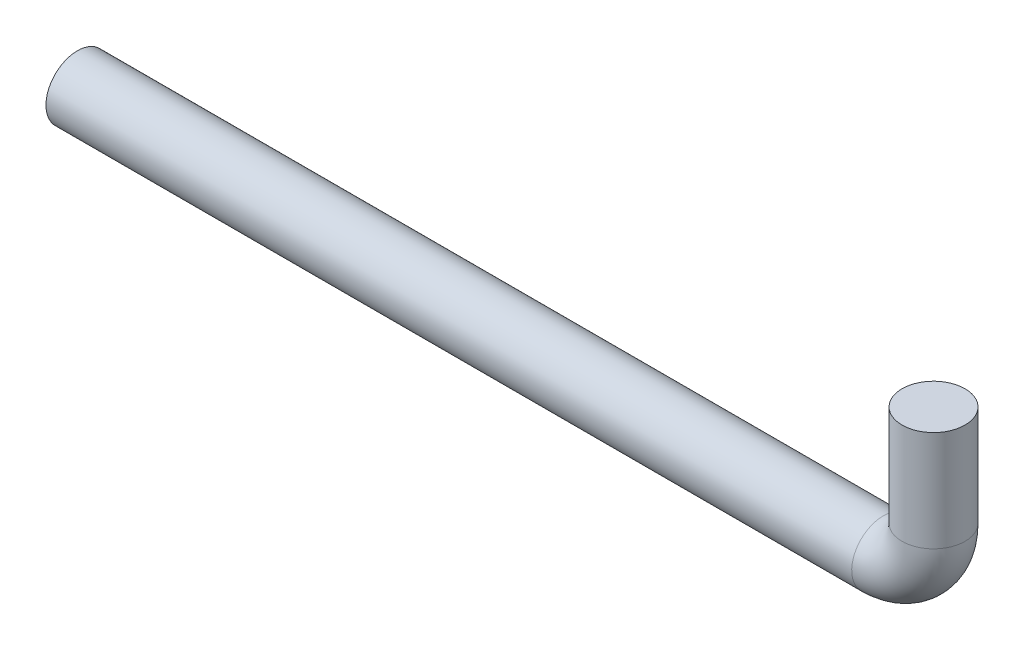
ISO-10303-21;
HEADER;
FILE_DESCRIPTION(('STEP AP214'),'2;1');
FILE_NAME('part.step','',(''),(''),'','','');
FILE_SCHEMA(('AUTOMOTIVE_DESIGN { 1 0 10303 214 1 1 1 1 }'));
ENDSEC;
DATA;
#1=APPLICATION_CONTEXT('core data for automotive mechanical design processes');
#2=APPLICATION_PROTOCOL_DEFINITION('international standard','automotive_design',2000,#1);
#3=PRODUCT_CONTEXT('',#1,'mechanical');
#4=PRODUCT('Part','Part','',(#3));
#5=PRODUCT_RELATED_PRODUCT_CATEGORY('part','',(#4));
#6=PRODUCT_DEFINITION_FORMATION('','',#4);
#7=PRODUCT_DEFINITION_CONTEXT('part definition',#1,'design');
#8=PRODUCT_DEFINITION('design','',#6,#7);
#9=PRODUCT_DEFINITION_SHAPE('','',#8);
#10=(LENGTH_UNIT() NAMED_UNIT(*) SI_UNIT(.MILLI.,.METRE.));
#11=(NAMED_UNIT(*) PLANE_ANGLE_UNIT() SI_UNIT($,.RADIAN.));
#12=(NAMED_UNIT(*) SI_UNIT($,.STERADIAN.) SOLID_ANGLE_UNIT());
#13=UNCERTAINTY_MEASURE_WITH_UNIT(LENGTH_MEASURE(1.E-05),#10,'distance_accuracy_value','');
#14=(GEOMETRIC_REPRESENTATION_CONTEXT(3) GLOBAL_UNCERTAINTY_ASSIGNED_CONTEXT((#13)) GLOBAL_UNIT_ASSIGNED_CONTEXT((#10,
#11,#12)) REPRESENTATION_CONTEXT('',''));
#15=CARTESIAN_POINT('',(0.,0.,0.));
#16=DIRECTION('',(0.,0.,1.));
#17=DIRECTION('',(1.,0.,0.));
#18=AXIS2_PLACEMENT_3D('',#15,#16,#17);
#19=CARTESIAN_POINT('',(0.,0.,0.));
#20=DIRECTION('',(1.,0.,0.));
#21=DIRECTION('',(0.,0.,-1.));
#22=AXIS2_PLACEMENT_3D('',#19,#20,#21);
#23=PLANE('',#22);
#24=CARTESIAN_POINT('',(0.,0.,0.));
#25=DIRECTION('',(1.,0.,0.));
#26=DIRECTION('',(0.,0.,-1.));
#27=AXIS2_PLACEMENT_3D('',#24,#25,#26);
#28=CIRCLE('',#27,0.79375);
#29=CARTESIAN_POINT('',(0.,0.,-0.79375));
#30=VERTEX_POINT('',#29);
#31=EDGE_CURVE('E49',#30,#30,#28,.T.);
#32=ORIENTED_EDGE('',*,*,#31,.F.);
#33=EDGE_LOOP('',(#32));
#34=FACE_BOUND('',#33,.T.);
#35=ADVANCED_FACE('F37',(#34),#23,.F.);
#36=CARTESIAN_POINT('',(21.59,3.81,0.));
#37=DIRECTION('',(0.,1.,0.));
#38=DIRECTION('',(0.,0.,-1.));
#39=AXIS2_PLACEMENT_3D('',#36,#37,#38);
#40=PLANE('',#39);
#41=CARTESIAN_POINT('',(21.59,3.81,0.));
#42=DIRECTION('',(0.,1.,0.));
#43=DIRECTION('',(0.,0.,-1.));
#44=AXIS2_PLACEMENT_3D('',#41,#42,#43);
#45=CIRCLE('',#44,0.79375);
#46=CARTESIAN_POINT('',(21.59,3.81,-0.79375));
#47=VERTEX_POINT('',#46);
#48=EDGE_CURVE('E11',#47,#47,#45,.T.);
#49=ORIENTED_EDGE('',*,*,#48,.T.);
#50=EDGE_LOOP('',(#49));
#51=FACE_BOUND('',#50,.T.);
#52=ADVANCED_FACE('F52',(#51),#40,.T.);
#53=CARTESIAN_POINT('',(0.,0.,0.));
#54=DIRECTION('',(1.,0.,0.));
#55=DIRECTION('',(0.,0.,-1.));
#56=AXIS2_PLACEMENT_3D('',#53,#54,#55);
#57=CYLINDRICAL_SURFACE('',#56,0.79375);
#58=CARTESIAN_POINT('',(20.32,0.,0.));
#59=DIRECTION('',(1.,0.,0.));
#60=DIRECTION('',(0.,0.,-1.));
#61=AXIS2_PLACEMENT_3D('',#58,#59,#60);
#62=CIRCLE('',#61,0.79375);
#63=CARTESIAN_POINT('',(20.32,-0.79375,0.));
#64=VERTEX_POINT('',#63);
#65=EDGE_CURVE('E62',#64,#64,#62,.T.);
#66=ORIENTED_EDGE('',*,*,#65,.F.);
#67=EDGE_LOOP('',(#66));
#68=FACE_BOUND('',#67,.T.);
#69=ORIENTED_EDGE('',*,*,#31,.T.);
#70=EDGE_LOOP('',(#69));
#71=FACE_BOUND('',#70,.T.);
#72=ADVANCED_FACE('F67',(#68,#71),#57,.T.);
#73=CARTESIAN_POINT('',(20.32,1.27,0.));
#74=DIRECTION('',(0.,0.,1.));
#75=DIRECTION('',(1.,0.,0.));
#76=AXIS2_PLACEMENT_3D('',#73,#74,#75);
#77=TOROIDAL_SURFACE('',#76,1.27,0.79375);
#78=CARTESIAN_POINT('',(21.59,1.27,0.));
#79=DIRECTION('',(0.,1.,0.));
#80=DIRECTION('',(0.,0.,-1.));
#81=AXIS2_PLACEMENT_3D('',#78,#79,#80);
#82=CIRCLE('',#81,0.79375);
#83=CARTESIAN_POINT('',(22.38375,1.27,0.));
#84=VERTEX_POINT('',#83);
#85=EDGE_CURVE('E44',#84,#84,#82,.T.);
#86=CARTESIAN_POINT('',(20.32,1.27,0.));
#87=DIRECTION('',(0.,0.,1.));
#88=DIRECTION('',(1.,0.,0.));
#89=AXIS2_PLACEMENT_3D('',#86,#87,#88);
#90=CIRCLE('',#89,2.06375);
#91=EDGE_CURVE('',#64,#84,#90,.T.);
#92=ORIENTED_EDGE('',*,*,#65,.T.);
#93=ORIENTED_EDGE('',*,*,#85,.F.);
#94=ORIENTED_EDGE('',*,*,#91,.T.);
#95=ORIENTED_EDGE('',*,*,#91,.F.);
#96=EDGE_LOOP('',(#92,#94,#93,#95));
#97=FACE_BOUND('',#96,.T.);
#98=ADVANCED_FACE('F57',(#97),#77,.T.);
#99=CARTESIAN_POINT('',(21.59,1.27,0.));
#100=DIRECTION('',(0.,1.,0.));
#101=DIRECTION('',(-1.,0.,0.));
#102=AXIS2_PLACEMENT_3D('',#99,#100,#101);
#103=CYLINDRICAL_SURFACE('',#102,0.79375);
#104=ORIENTED_EDGE('',*,*,#48,.F.);
#105=EDGE_LOOP('',(#104));
#106=FACE_BOUND('',#105,.T.);
#107=ORIENTED_EDGE('',*,*,#85,.T.);
#108=EDGE_LOOP('',(#107));
#109=FACE_BOUND('',#108,.T.);
#110=ADVANCED_FACE('F54',(#106,#109),#103,.T.);
#111=CLOSED_SHELL('',(#35,#52,#72,#98,#110));
#112=MANIFOLD_SOLID_BREP('B2',#111);
#113=ADVANCED_BREP_SHAPE_REPRESENTATION('',(#18,#112),#14);
#114=SHAPE_DEFINITION_REPRESENTATION(#9,#113);
ENDSEC;
END-ISO-10303-21;
